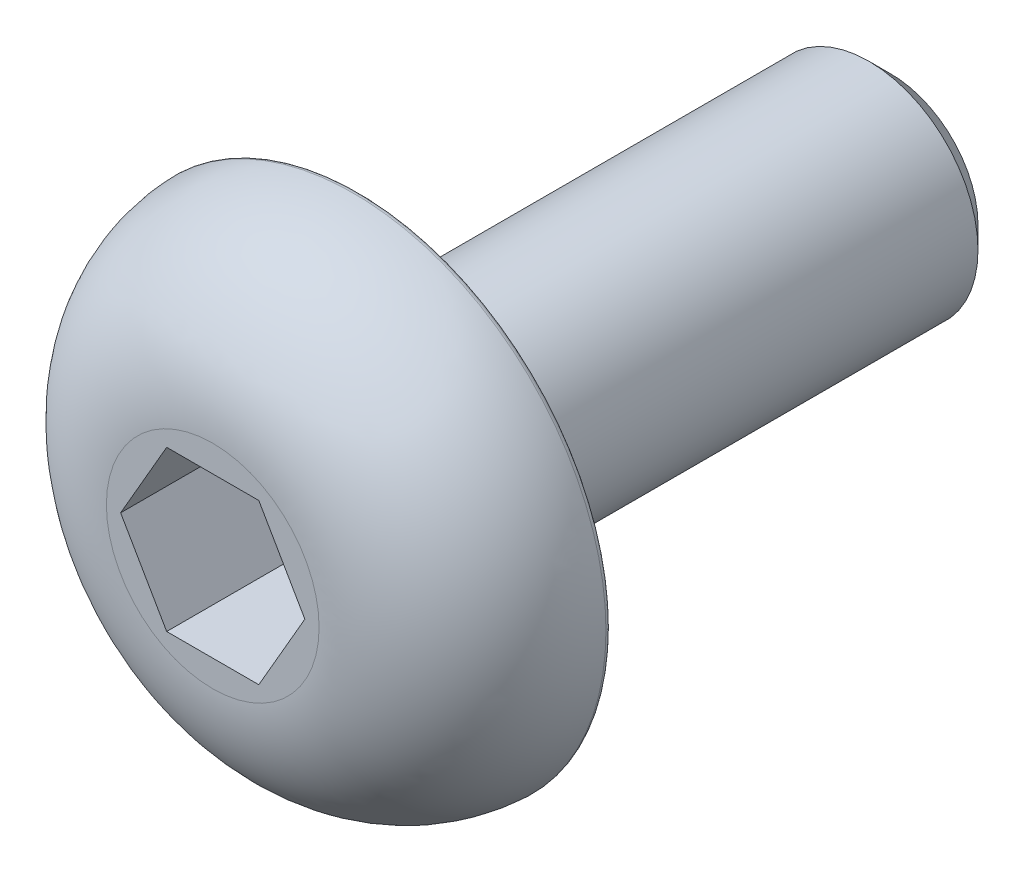
ISO-10303-21;
HEADER;
FILE_DESCRIPTION(('STEP AP214'),'2;1');
FILE_NAME('part.step','',(''),(''),'','','');
FILE_SCHEMA(('AUTOMOTIVE_DESIGN { 1 0 10303 214 1 1 1 1 }'));
ENDSEC;
DATA;
#1=APPLICATION_CONTEXT('core data for automotive mechanical design processes');
#2=APPLICATION_PROTOCOL_DEFINITION('international standard','automotive_design',2000,#1);
#3=PRODUCT_CONTEXT('',#1,'mechanical');
#4=PRODUCT('Part','Part','',(#3));
#5=PRODUCT_RELATED_PRODUCT_CATEGORY('part','',(#4));
#6=PRODUCT_DEFINITION_FORMATION('','',#4);
#7=PRODUCT_DEFINITION_CONTEXT('part definition',#1,'design');
#8=PRODUCT_DEFINITION('design','',#6,#7);
#9=PRODUCT_DEFINITION_SHAPE('','',#8);
#10=(LENGTH_UNIT() NAMED_UNIT(*) SI_UNIT(.MILLI.,.METRE.));
#11=(NAMED_UNIT(*) PLANE_ANGLE_UNIT() SI_UNIT($,.RADIAN.));
#12=(NAMED_UNIT(*) SI_UNIT($,.STERADIAN.) SOLID_ANGLE_UNIT());
#13=UNCERTAINTY_MEASURE_WITH_UNIT(LENGTH_MEASURE(1.E-05),#10,'distance_accuracy_value','');
#14=(GEOMETRIC_REPRESENTATION_CONTEXT(3) GLOBAL_UNCERTAINTY_ASSIGNED_CONTEXT((#13)) GLOBAL_UNIT_ASSIGNED_CONTEXT((#10,
#11,#12)) REPRESENTATION_CONTEXT('',''));
#15=CARTESIAN_POINT('',(0.,0.,0.));
#16=DIRECTION('',(0.,0.,1.));
#17=DIRECTION('',(1.,0.,0.));
#18=AXIS2_PLACEMENT_3D('',#15,#16,#17);
#19=CARTESIAN_POINT('',(1.73205080756888,0.,0.));
#20=DIRECTION('',(0.,0.,1.));
#21=DIRECTION('',(1.,0.,0.));
#22=AXIS2_PLACEMENT_3D('',#19,#20,#21);
#23=PLANE('',#22);
#24=DIRECTION('',(-0.499999999989974,-0.866025403790227,0.));
#25=VECTOR('',#24,1.);
#26=CARTESIAN_POINT('',(1.73205080750449,2.70388637695074E-11,0.));
#27=LINE('',#26,#25);
#28=CARTESIAN_POINT('',(1.73205080744029,-3.38584002566252E-11,-4.9737991503207E-11));
#29=VERTEX_POINT('',#28);
#30=CARTESIAN_POINT('',(0.866025403756816,-1.49999999996496,-3.22520851709708E-11));
#31=VERTEX_POINT('',#30);
#32=EDGE_CURVE('E89',#29,#31,#27,.T.);
#33=ORIENTED_EDGE('',*,*,#32,.F.);
#34=CARTESIAN_POINT('',(0.,0.,-6.45041703419416E-11));
#35=DIRECTION('',(0.,0.,1.));
#36=DIRECTION('',(1.,0.,0.));
#37=AXIS2_PLACEMENT_3D('',#34,#35,#36);
#38=CIRCLE('',#37,1.73205080750449);
#39=EDGE_CURVE('E91',#29,#31,#38,.F.);
#40=ORIENTED_EDGE('',*,*,#39,.T.);
#41=EDGE_LOOP('',(#33,#40));
#42=FACE_BOUND('',#41,.T.);
#43=ADVANCED_FACE('F16',(#42),#23,.F.);
#44=CARTESIAN_POINT('',(1.73205080756888,0.,0.));
#45=DIRECTION('',(0.,0.,1.));
#46=DIRECTION('',(1.,0.,0.));
#47=AXIS2_PLACEMENT_3D('',#44,#45,#46);
#48=PLANE('',#47);
#49=DIRECTION('',(1.,0.,0.));
#50=VECTOR('',#49,1.);
#51=CARTESIAN_POINT('',(1.73205080756888,-1.49999999993771,0.));
#52=LINE('',#51,#50);
#53=CARTESIAN_POINT('',(-0.866025403784875,-1.49999999994386,-3.22520851709708E-11));
#54=VERTEX_POINT('',#53);
#55=EDGE_CURVE('E97',#31,#54,#52,.F.);
#56=ORIENTED_EDGE('',*,*,#55,.F.);
#57=CARTESIAN_POINT('',(0.,0.,-6.45041703419416E-11));
#58=DIRECTION('',(0.,0.,1.));
#59=DIRECTION('',(1.,0.,0.));
#60=AXIS2_PLACEMENT_3D('',#57,#58,#59);
#61=CIRCLE('',#60,1.73205080750449);
#62=EDGE_CURVE('E109',#31,#54,#61,.F.);
#63=ORIENTED_EDGE('',*,*,#62,.T.);
#64=EDGE_LOOP('',(#56,#63));
#65=FACE_BOUND('',#64,.T.);
#66=ADVANCED_FACE('F268',(#65),#48,.F.);
#67=CARTESIAN_POINT('',(1.73205080756888,0.,0.));
#68=DIRECTION('',(0.,0.,1.));
#69=DIRECTION('',(1.,0.,0.));
#70=AXIS2_PLACEMENT_3D('',#67,#68,#69);
#71=PLANE('',#70);
#72=DIRECTION('',(-0.500000000020841,0.866025403772406,0.));
#73=VECTOR('',#72,1.);
#74=CARTESIAN_POINT('',(-0.866025403763559,-1.49999999993771,0.));
#75=LINE('',#74,#73);
#76=CARTESIAN_POINT('',(-1.73205080746782,-9.79143967598048E-12,-4.2632564145606E-11));
#77=VERTEX_POINT('',#76);
#78=EDGE_CURVE('E142',#54,#77,#75,.T.);
#79=ORIENTED_EDGE('',*,*,#78,.F.);
#80=CARTESIAN_POINT('',(0.,0.,-6.45041703419416E-11));
#81=DIRECTION('',(0.,0.,1.));
#82=DIRECTION('',(1.,0.,0.));
#83=AXIS2_PLACEMENT_3D('',#80,#81,#82);
#84=CIRCLE('',#83,1.73205080750449);
#85=EDGE_CURVE('E167',#54,#77,#84,.F.);
#86=ORIENTED_EDGE('',*,*,#85,.T.);
#87=EDGE_LOOP('',(#79,#86));
#88=FACE_BOUND('',#87,.T.);
#89=ADVANCED_FACE('F262',(#88),#71,.F.);
#90=CARTESIAN_POINT('',(1.73205080756888,0.,0.));
#91=DIRECTION('',(0.,0.,1.));
#92=DIRECTION('',(1.,0.,0.));
#93=AXIS2_PLACEMENT_3D('',#90,#91,#92);
#94=PLANE('',#93);
#95=DIRECTION('',(0.499999999990634,0.866025403789846,0.));
#96=VECTOR('',#95,1.);
#97=CARTESIAN_POINT('',(-1.73205080752528,-6.04136146885093E-11,0.));
#98=LINE('',#97,#96);
#99=CARTESIAN_POINT('',(-0.86602540376309,1.49999999996314,-3.22520851709708E-11));
#100=VERTEX_POINT('',#99);
#101=EDGE_CURVE('E140',#77,#100,#98,.T.);
#102=ORIENTED_EDGE('',*,*,#101,.F.);
#103=CARTESIAN_POINT('',(0.,0.,-6.45041703419416E-11));
#104=DIRECTION('',(0.,0.,1.));
#105=DIRECTION('',(1.,0.,0.));
#106=AXIS2_PLACEMENT_3D('',#103,#104,#105);
#107=CIRCLE('',#106,1.73205080750449);
#108=EDGE_CURVE('E164',#77,#100,#107,.F.);
#109=ORIENTED_EDGE('',*,*,#108,.T.);
#110=EDGE_LOOP('',(#102,#109));
#111=FACE_BOUND('',#110,.T.);
#112=ADVANCED_FACE('F254',(#111),#94,.F.);
#113=CARTESIAN_POINT('',(1.73205080756888,0.,0.));
#114=DIRECTION('',(0.,0.,1.));
#115=DIRECTION('',(1.,0.,0.));
#116=AXIS2_PLACEMENT_3D('',#113,#114,#115);
#117=PLANE('',#116);
#118=DIRECTION('',(1.,0.,0.));
#119=VECTOR('',#118,1.);
#120=CARTESIAN_POINT('',(1.73205080756888,1.49999999993771,0.));
#121=LINE('',#120,#119);
#122=CARTESIAN_POINT('',(0.86602540379129,1.4999999999217,-6.45041703419416E-11));
#123=VERTEX_POINT('',#122);
#124=EDGE_CURVE('E110',#100,#123,#121,.T.);
#125=ORIENTED_EDGE('',*,*,#124,.F.);
#126=CARTESIAN_POINT('',(0.,0.,-6.45041703419416E-11));
#127=DIRECTION('',(0.,0.,1.));
#128=DIRECTION('',(1.,0.,0.));
#129=AXIS2_PLACEMENT_3D('',#126,#127,#128);
#130=CIRCLE('',#129,1.73205080750449);
#131=EDGE_CURVE('E117',#100,#123,#130,.F.);
#132=ORIENTED_EDGE('',*,*,#131,.T.);
#133=EDGE_LOOP('',(#125,#132));
#134=FACE_BOUND('',#133,.T.);
#135=ADVANCED_FACE('F250',(#134),#117,.F.);
#136=CARTESIAN_POINT('',(0.,0.,-1.70530256582424E-10));
#137=DIRECTION('',(0.,0.,1.));
#138=DIRECTION('',(1.,0.,0.));
#139=AXIS2_PLACEMENT_3D('',#136,#137,#138);
#140=CONICAL_SURFACE('',#139,1.73205080727712,1.13446401336839);
#141=CARTESIAN_POINT('',(2.8421709430404E-10,0.,-0.807668556376484));
#142=VERTEX_POINT('',#141);
#143=VERTEX_LOOP('',#142);
#144=FACE_BOUND('',#143,.T.);
#145=ORIENTED_EDGE('',*,*,#39,.F.);
#146=CARTESIAN_POINT('',(0.,0.,-6.45041703419416E-11));
#147=DIRECTION('',(0.,0.,1.));
#148=DIRECTION('',(1.,0.,0.));
#149=AXIS2_PLACEMENT_3D('',#146,#147,#148);
#150=CIRCLE('',#149,1.73205080750449);
#151=EDGE_CURVE('E105',#29,#123,#150,.T.);
#152=ORIENTED_EDGE('',*,*,#151,.T.);
#153=ORIENTED_EDGE('',*,*,#131,.F.);
#154=ORIENTED_EDGE('',*,*,#108,.F.);
#155=ORIENTED_EDGE('',*,*,#85,.F.);
#156=ORIENTED_EDGE('',*,*,#62,.F.);
#157=EDGE_LOOP('',(#145,#152,#153,#154,#155,#156));
#158=FACE_BOUND('',#157,.T.);
#159=ADVANCED_FACE('F103',(#144,#158),#140,.F.);
#160=CARTESIAN_POINT('',(1.73205080756888,0.,0.));
#161=DIRECTION('',(0.,0.,1.));
#162=DIRECTION('',(1.,0.,0.));
#163=AXIS2_PLACEMENT_3D('',#160,#161,#162);
#164=PLANE('',#163);
#165=DIRECTION('',(-0.5,0.866025403784438,0.));
#166=VECTOR('',#165,1.);
#167=CARTESIAN_POINT('',(1.73205080756888,0.,-2.8421709430404E-11));
#168=LINE('',#167,#166);
#169=EDGE_CURVE('E115',#29,#123,#168,.T.);
#170=ORIENTED_EDGE('',*,*,#169,.T.);
#171=ORIENTED_EDGE('',*,*,#151,.F.);
#172=EDGE_LOOP('',(#170,#171));
#173=FACE_BOUND('',#172,.T.);
#174=ADVANCED_FACE('F114',(#173),#164,.F.);
#175=CARTESIAN_POINT('',(1.73205080756888,0.,0.));
#176=DIRECTION('',(0.866025403784438,0.5,0.));
#177=DIRECTION('',(-0.5,0.866025403784438,0.));
#178=AXIS2_PLACEMENT_3D('',#175,#176,#177);
#179=PLANE('',#178);
#180=DIRECTION('',(0.,0.,1.));
#181=VECTOR('',#180,1.);
#182=CARTESIAN_POINT('',(0.866025403800783,1.5,0.));
#183=LINE('',#182,#181);
#184=CARTESIAN_POINT('',(0.866025403791551,1.49999999999437,2.75));
#185=VERTEX_POINT('',#184);
#186=EDGE_CURVE('E125',#185,#123,#183,.F.);
#187=ORIENTED_EDGE('',*,*,#186,.T.);
#188=ORIENTED_EDGE('',*,*,#169,.F.);
#189=DIRECTION('',(0.,0.,1.));
#190=VECTOR('',#189,1.);
#191=CARTESIAN_POINT('',(1.73205080756449,-7.60004038868889E-12,0.));
#192=LINE('',#191,#190);
#193=CARTESIAN_POINT('',(1.73205080756693,6.138909028857E-12,2.75));
#194=VERTEX_POINT('',#193);
#195=EDGE_CURVE('E122',#29,#194,#192,.T.);
#196=ORIENTED_EDGE('',*,*,#195,.T.);
#197=DIRECTION('',(-0.5,0.866025403784438,0.));
#198=VECTOR('',#197,1.);
#199=CARTESIAN_POINT('',(1.73205080756888,0.,2.75));
#200=LINE('',#199,#198);
#201=EDGE_CURVE('E126',#185,#194,#200,.F.);
#202=ORIENTED_EDGE('',*,*,#201,.F.);
#203=EDGE_LOOP('',(#187,#188,#196,#202));
#204=FACE_BOUND('',#203,.T.);
#205=ADVANCED_FACE('F121',(#204),#179,.F.);
#206=CARTESIAN_POINT('',(0.866025403784438,1.5,0.));
#207=DIRECTION('',(0.,1.,0.));
#208=DIRECTION('',(-1.,0.,0.));
#209=AXIS2_PLACEMENT_3D('',#206,#207,#208);
#210=PLANE('',#209);
#211=DIRECTION('',(0.,0.,1.));
#212=VECTOR('',#211,1.);
#213=CARTESIAN_POINT('',(-0.866025403783938,1.50000000000087,0.));
#214=LINE('',#213,#212);
#215=CARTESIAN_POINT('',(-0.866025403773903,1.50000000000052,2.75));
#216=VERTEX_POINT('',#215);
#217=EDGE_CURVE('E132',#216,#100,#214,.F.);
#218=ORIENTED_EDGE('',*,*,#217,.T.);
#219=ORIENTED_EDGE('',*,*,#124,.T.);
#220=ORIENTED_EDGE('',*,*,#186,.F.);
#221=DIRECTION('',(-1.,0.,0.));
#222=VECTOR('',#221,1.);
#223=CARTESIAN_POINT('',(0.866025403784438,1.5,2.75));
#224=LINE('',#223,#222);
#225=EDGE_CURVE('E130',#216,#185,#224,.F.);
#226=ORIENTED_EDGE('',*,*,#225,.F.);
#227=EDGE_LOOP('',(#218,#219,#220,#226));
#228=FACE_BOUND('',#227,.T.);
#229=ADVANCED_FACE('F247',(#228),#210,.F.);
#230=CARTESIAN_POINT('',(0.866025403784439,-1.5,0.));
#231=DIRECTION('',(0.866025403784439,-0.5,0.));
#232=DIRECTION('',(0.5,0.866025403784439,0.));
#233=AXIS2_PLACEMENT_3D('',#230,#231,#232);
#234=PLANE('',#233);
#235=ORIENTED_EDGE('',*,*,#195,.F.);
#236=ORIENTED_EDGE('',*,*,#32,.T.);
#237=DIRECTION('',(0.,0.,-1.));
#238=VECTOR('',#237,1.);
#239=CARTESIAN_POINT('',(0.86602540376356,-1.5,0.));
#240=LINE('',#239,#238);
#241=CARTESIAN_POINT('',(0.866025403780898,-1.49999999999878,2.75));
#242=VERTEX_POINT('',#241);
#243=EDGE_CURVE('E156',#31,#242,#240,.F.);
#244=ORIENTED_EDGE('',*,*,#243,.T.);
#245=DIRECTION('',(0.5,0.866025403784439,0.));
#246=VECTOR('',#245,1.);
#247=CARTESIAN_POINT('',(0.866025403784439,-1.5,2.75));
#248=LINE('',#247,#246);
#249=EDGE_CURVE('E129',#194,#242,#248,.F.);
#250=ORIENTED_EDGE('',*,*,#249,.F.);
#251=EDGE_LOOP('',(#235,#236,#244,#250));
#252=FACE_BOUND('',#251,.T.);
#253=ADVANCED_FACE('F128',(#252),#234,.F.);
#254=CARTESIAN_POINT('',(-0.866025403784439,1.5,0.));
#255=DIRECTION('',(-0.866025403784439,0.5,0.));
#256=DIRECTION('',(-0.5,-0.866025403784439,0.));
#257=AXIS2_PLACEMENT_3D('',#254,#255,#256);
#258=PLANE('',#257);
#259=DIRECTION('',(0.,0.,1.));
#260=VECTOR('',#259,1.);
#261=CARTESIAN_POINT('',(-1.73205080756454,-7.51785919718789E-12,0.));
#262=LINE('',#261,#260);
#263=CARTESIAN_POINT('',(-1.73205080757668,-1.83261214268185E-11,2.75));
#264=VERTEX_POINT('',#263);
#265=EDGE_CURVE('E148',#264,#77,#262,.F.);
#266=ORIENTED_EDGE('',*,*,#265,.T.);
#267=ORIENTED_EDGE('',*,*,#101,.T.);
#268=ORIENTED_EDGE('',*,*,#217,.F.);
#269=DIRECTION('',(-0.5,-0.866025403784439,0.));
#270=VECTOR('',#269,1.);
#271=CARTESIAN_POINT('',(-0.866025403784439,1.5,2.75));
#272=LINE('',#271,#270);
#273=EDGE_CURVE('E147',#264,#216,#272,.F.);
#274=ORIENTED_EDGE('',*,*,#273,.F.);
#275=EDGE_LOOP('',(#266,#267,#268,#274));
#276=FACE_BOUND('',#275,.T.);
#277=ADVANCED_FACE('F256',(#276),#258,.F.);
#278=CARTESIAN_POINT('',(-0.866025403784438,-1.5,0.));
#279=DIRECTION('',(0.,-1.,0.));
#280=DIRECTION('',(0.,0.,-1.));
#281=AXIS2_PLACEMENT_3D('',#278,#279,#280);
#282=PLANE('',#281);
#283=ORIENTED_EDGE('',*,*,#243,.F.);
#284=ORIENTED_EDGE('',*,*,#55,.T.);
#285=DIRECTION('',(0.,0.,1.));
#286=VECTOR('',#285,1.);
#287=CARTESIAN_POINT('',(-0.86602540380619,-1.49999999996232,0.));
#288=LINE('',#287,#286);
#289=CARTESIAN_POINT('',(-0.866025403794406,-1.49999999999045,2.75));
#290=VERTEX_POINT('',#289);
#291=EDGE_CURVE('E151',#54,#290,#288,.T.);
#292=ORIENTED_EDGE('',*,*,#291,.T.);
#293=DIRECTION('',(1.,0.,0.));
#294=VECTOR('',#293,1.);
#295=CARTESIAN_POINT('',(-0.866025403784438,-1.5,2.75));
#296=LINE('',#295,#294);
#297=EDGE_CURVE('E152',#242,#290,#296,.F.);
#298=ORIENTED_EDGE('',*,*,#297,.F.);
#299=EDGE_LOOP('',(#283,#284,#292,#298));
#300=FACE_BOUND('',#299,.T.);
#301=ADVANCED_FACE('F269',(#300),#282,.F.);
#302=CARTESIAN_POINT('',(-1.73205080756888,0.,0.));
#303=DIRECTION('',(-0.866025403784438,-0.5,0.));
#304=DIRECTION('',(0.5,-0.866025403784438,0.));
#305=AXIS2_PLACEMENT_3D('',#302,#303,#304);
#306=PLANE('',#305);
#307=ORIENTED_EDGE('',*,*,#291,.F.);
#308=ORIENTED_EDGE('',*,*,#78,.T.);
#309=ORIENTED_EDGE('',*,*,#265,.F.);
#310=DIRECTION('',(-0.500000000005838,0.866025403781068,0.));
#311=VECTOR('',#310,1.);
#312=CARTESIAN_POINT('',(-0.866025403793856,-1.49999999998194,2.75));
#313=LINE('',#312,#311);
#314=EDGE_CURVE('E155',#290,#264,#313,.T.);
#315=ORIENTED_EDGE('',*,*,#314,.F.);
#316=EDGE_LOOP('',(#307,#308,#309,#315));
#317=FACE_BOUND('',#316,.T.);
#318=ADVANCED_FACE('F264',(#317),#306,.F.);
#319=CARTESIAN_POINT('',(0.,0.,2.75));
#320=DIRECTION('',(0.,0.,1.));
#321=DIRECTION('',(1.,0.,0.));
#322=AXIS2_PLACEMENT_3D('',#319,#320,#321);
#323=PLANE('',#322);
#324=ORIENTED_EDGE('',*,*,#297,.T.);
#325=ORIENTED_EDGE('',*,*,#314,.T.);
#326=ORIENTED_EDGE('',*,*,#273,.T.);
#327=ORIENTED_EDGE('',*,*,#225,.T.);
#328=ORIENTED_EDGE('',*,*,#201,.T.);
#329=ORIENTED_EDGE('',*,*,#249,.T.);
#330=EDGE_LOOP('',(#324,#325,#326,#327,#328,#329));
#331=FACE_BOUND('',#330,.T.);
#332=CARTESIAN_POINT('',(0.,0.,2.75));
#333=DIRECTION('',(0.,0.,-1.));
#334=DIRECTION('',(1.,0.,0.));
#335=AXIS2_PLACEMENT_3D('',#332,#333,#334);
#336=CIRCLE('',#335,2.00000000000163);
#337=CARTESIAN_POINT('',(2.00000000005148,-3.77351845645044E-07,2.75));
#338=VERTEX_POINT('',#337);
#339=CARTESIAN_POINT('',(-1.47936455345811E-08,-2.00000000000592,2.75));
#340=VERTEX_POINT('',#339);
#341=EDGE_CURVE('E270',#338,#340,#336,.T.);
#342=ORIENTED_EDGE('',*,*,#341,.F.);
#343=CARTESIAN_POINT('',(0.,0.,2.75));
#344=DIRECTION('',(0.,0.,-1.));
#345=DIRECTION('',(1.33144338389548E-08,1.,0.));
#346=AXIS2_PLACEMENT_3D('',#343,#344,#345);
#347=CIRCLE('',#346,2.000000000202);
#348=CARTESIAN_POINT('',(2.66288678715073E-08,2.00000000028081,2.75));
#349=VERTEX_POINT('',#348);
#350=EDGE_CURVE('E209',#349,#338,#347,.T.);
#351=ORIENTED_EDGE('',*,*,#350,.F.);
#352=CARTESIAN_POINT('',(0.,0.,2.75));
#353=DIRECTION('',(0.,0.,-1.));
#354=DIRECTION('',(-0.999999999999725,-7.42154887644766E-07,0.));
#355=AXIS2_PLACEMENT_3D('',#352,#353,#354);
#356=CIRCLE('',#355,2.00000000051726);
#357=CARTESIAN_POINT('',(-2.00000000041473,-1.48430977605223E-06,2.75));
#358=VERTEX_POINT('',#357);
#359=EDGE_CURVE('E279',#358,#349,#356,.T.);
#360=ORIENTED_EDGE('',*,*,#359,.F.);
#361=CARTESIAN_POINT('',(0.,0.,2.75));
#362=DIRECTION('',(0.,0.,-1.));
#363=DIRECTION('',(-7.39682289359008E-09,-1.,0.));
#364=AXIS2_PLACEMENT_3D('',#361,#362,#363);
#365=CIRCLE('',#364,2.00000000000735);
#366=EDGE_CURVE('E272',#340,#358,#365,.T.);
#367=ORIENTED_EDGE('',*,*,#366,.F.);
#368=EDGE_LOOP('',(#342,#351,#360,#367));
#369=FACE_BOUND('',#368,.T.);
#370=ADVANCED_FACE('F218',(#331,#369),#323,.T.);
#371=CARTESIAN_POINT('',(2.,0.,0.));
#372=DIRECTION('',(0.,1.,0.));
#373=DIRECTION('',(1.,0.,0.));
#374=AXIS2_PLACEMENT_3D('',#371,#372,#373);
#375=CIRCLE('',#374,2.75);
#376=TRIMMED_CURVE('',#375,(PARAMETER_VALUE(-2.38513626892142)),
(PARAMETER_VALUE(2.38513626892142)),.T.,.PARAMETER.);
#377=CARTESIAN_POINT('',(0.,0.,0.));
#378=DIRECTION('',(0.,0.,1.));
#379=AXIS1_PLACEMENT('',#377,#378);
#380=SURFACE_OF_REVOLUTION('',#376,#379);
#381=ORIENTED_EDGE('',*,*,#366,.T.);
#382=ORIENTED_EDGE('',*,*,#359,.T.);
#383=ORIENTED_EDGE('',*,*,#350,.T.);
#384=ORIENTED_EDGE('',*,*,#341,.T.);
#385=EDGE_LOOP('',(#381,#382,#383,#384));
#386=FACE_BOUND('',#385,.T.);
#387=CARTESIAN_POINT('',(0.,0.,0.10377358490566));
#388=DIRECTION('',(0.,0.,1.));
#389=DIRECTION('',(1.,0.,0.));
#390=AXIS2_PLACEMENT_3D('',#387,#388,#389);
#391=CIRCLE('',#390,4.74804131029281);
#392=CARTESIAN_POINT('',(4.74804131029281,0.,0.10377358490566));
#393=VERTEX_POINT('',#392);
#394=EDGE_CURVE('E160',#393,#393,#391,.F.);
#395=ORIENTED_EDGE('',*,*,#394,.F.);
#396=EDGE_LOOP('',(#395));
#397=FACE_BOUND('',#396,.T.);
#398=ADVANCED_FACE('F214',(#386,#397),#380,.F.);
#399=CARTESIAN_POINT('',(0.,0.,-10.));
#400=DIRECTION('',(0.,0.,-1.));
#401=DIRECTION('',(-1.,0.,0.));
#402=AXIS2_PLACEMENT_3D('',#399,#400,#401);
#403=PLANE('',#402);
#404=CARTESIAN_POINT('',(0.,0.,-10.0000000001046));
#405=DIRECTION('',(0.,0.,1.));
#406=DIRECTION('',(1.,0.,0.));
#407=AXIS2_PLACEMENT_3D('',#404,#405,#406);
#408=CIRCLE('',#407,1.63999999989528);
#409=CARTESIAN_POINT('',(1.63999999989528,0.,-10.0000000001046));
#410=VERTEX_POINT('',#409);
#411=EDGE_CURVE('E158',#410,#410,#408,.T.);
#412=ORIENTED_EDGE('',*,*,#411,.F.);
#413=EDGE_LOOP('',(#412));
#414=FACE_BOUND('',#413,.T.);
#415=ADVANCED_FACE('F189',(#414),#403,.T.);
#416=CARTESIAN_POINT('',(0.,0.,0.1));
#417=DIRECTION('',(0.,0.,1.));
#418=DIRECTION('',(1.,0.,0.));
#419=AXIS2_PLACEMENT_3D('',#416,#417,#418);
#420=TOROIDAL_SURFACE('',#419,4.64811253537307,0.1);
#421=ORIENTED_EDGE('',*,*,#394,.T.);
#422=EDGE_LOOP('',(#421));
#423=FACE_BOUND('',#422,.T.);
#424=CARTESIAN_POINT('',(0.,0.,0.));
#425=DIRECTION('',(0.,0.,1.));
#426=DIRECTION('',(1.,0.,0.));
#427=AXIS2_PLACEMENT_3D('',#424,#425,#426);
#428=CIRCLE('',#427,4.64811253537307);
#429=CARTESIAN_POINT('',(4.64811253537307,0.,0.));
#430=VERTEX_POINT('',#429);
#431=CARTESIAN_POINT('',(-4.64811253537307,0.,0.));
#432=VERTEX_POINT('',#431);
#433=EDGE_CURVE('E198',#430,#432,#428,.T.);
#434=ORIENTED_EDGE('',*,*,#433,.T.);
#435=CARTESIAN_POINT('',(0.,0.,0.));
#436=DIRECTION('',(0.,0.,1.));
#437=DIRECTION('',(-1.,0.,0.));
#438=AXIS2_PLACEMENT_3D('',#435,#436,#437);
#439=CIRCLE('',#438,4.64811253537307);
#440=EDGE_CURVE('E35',#432,#430,#439,.T.);
#441=ORIENTED_EDGE('',*,*,#440,.T.);
#442=EDGE_LOOP('',(#434,#441));
#443=FACE_BOUND('',#442,.T.);
#444=ADVANCED_FACE('F177',(#423,#443),#420,.T.);
#445=CARTESIAN_POINT('',(0.,0.,-9.59000000011656));
#446=DIRECTION('',(0.,0.,1.));
#447=DIRECTION('',(1.,0.,0.));
#448=AXIS2_PLACEMENT_3D('',#445,#446,#447);
#449=CONICAL_SURFACE('',#448,2.04999999988331,0.785398163397448);
#450=CARTESIAN_POINT('',(0.,0.,-9.59));
#451=DIRECTION('',(0.,0.,1.));
#452=DIRECTION('',(1.,0.,0.));
#453=AXIS2_PLACEMENT_3D('',#450,#451,#452);
#454=CIRCLE('',#453,2.05);
#455=CARTESIAN_POINT('',(2.05,0.,-9.59));
#456=VERTEX_POINT('',#455);
#457=EDGE_CURVE('E27',#456,#456,#454,.T.);
#458=ORIENTED_EDGE('',*,*,#457,.F.);
#459=EDGE_LOOP('',(#458));
#460=FACE_BOUND('',#459,.T.);
#461=ORIENTED_EDGE('',*,*,#411,.T.);
#462=EDGE_LOOP('',(#461));
#463=FACE_BOUND('',#462,.T.);
#464=ADVANCED_FACE('F188',(#460,#463),#449,.T.);
#465=CARTESIAN_POINT('',(0.,0.,0.));
#466=DIRECTION('',(0.,0.,1.));
#467=DIRECTION('',(1.,0.,0.));
#468=AXIS2_PLACEMENT_3D('',#465,#466,#467);
#469=PLANE('',#468);
#470=CARTESIAN_POINT('',(0.,0.,0.));
#471=DIRECTION('',(0.,0.,1.));
#472=DIRECTION('',(1.,0.,0.));
#473=AXIS2_PLACEMENT_3D('',#470,#471,#472);
#474=CIRCLE('',#473,2.05);
#475=CARTESIAN_POINT('',(2.05,0.,0.));
#476=VERTEX_POINT('',#475);
#477=EDGE_CURVE('E11',#476,#476,#474,.F.);
#478=ORIENTED_EDGE('',*,*,#477,.F.);
#479=EDGE_LOOP('',(#478));
#480=FACE_BOUND('',#479,.T.);
#481=ORIENTED_EDGE('',*,*,#440,.F.);
#482=ORIENTED_EDGE('',*,*,#433,.F.);
#483=EDGE_LOOP('',(#481,#482));
#484=FACE_BOUND('',#483,.T.);
#485=ADVANCED_FACE('F289',(#480,#484),#469,.F.);
#486=CARTESIAN_POINT('',(0.,0.,-10.));
#487=DIRECTION('',(0.,0.,1.));
#488=DIRECTION('',(1.,0.,0.));
#489=AXIS2_PLACEMENT_3D('',#486,#487,#488);
#490=CYLINDRICAL_SURFACE('',#489,2.05);
#491=ORIENTED_EDGE('',*,*,#477,.T.);
#492=EDGE_LOOP('',(#491));
#493=FACE_BOUND('',#492,.T.);
#494=ORIENTED_EDGE('',*,*,#457,.T.);
#495=EDGE_LOOP('',(#494));
#496=FACE_BOUND('',#495,.T.);
#497=ADVANCED_FACE('F287',(#493,#496),#490,.T.);
#498=CLOSED_SHELL('',(#43,#66,#89,#112,#135,#159,#174,#205,#229,#253,#277,#301,#318,#370,#398,
#415,#444,#464,#485,#497));
#499=MANIFOLD_SOLID_BREP('B1',#498);
#500=ADVANCED_BREP_SHAPE_REPRESENTATION('',(#18,#499),#14);
#501=SHAPE_DEFINITION_REPRESENTATION(#9,#500);
ENDSEC;
END-ISO-10303-21;
